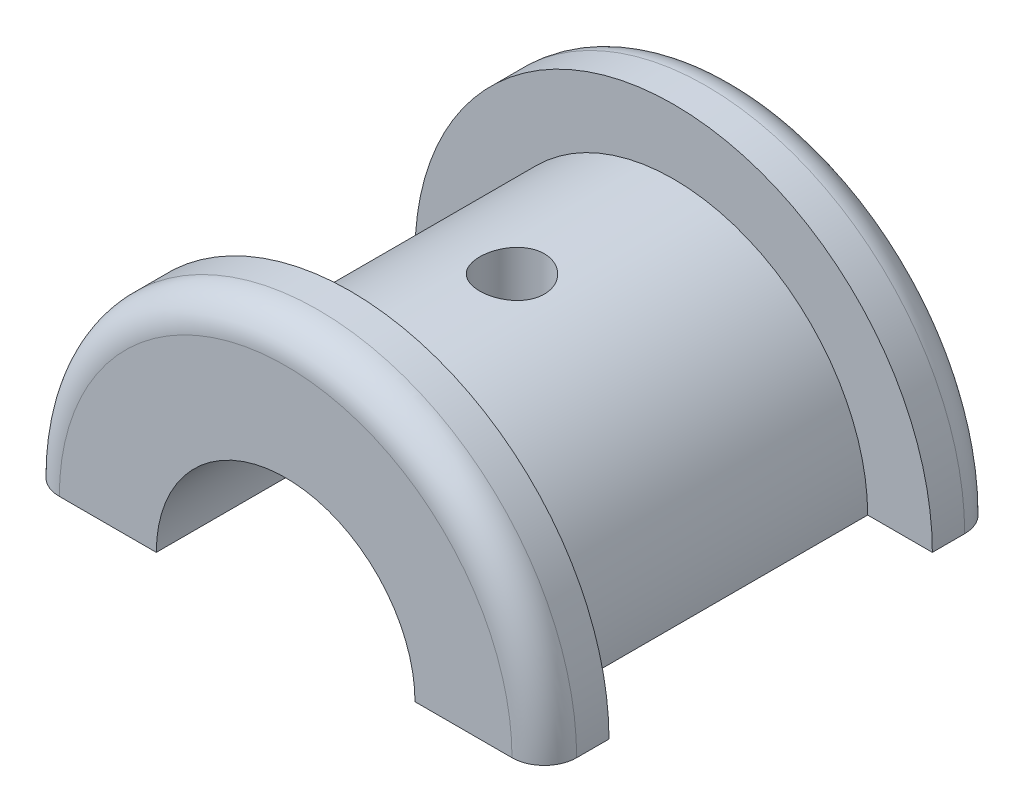
ISO-10303-21;
HEADER;
FILE_DESCRIPTION(('STEP AP214'),'2;1');
FILE_NAME('part.step','',(''),(''),'','','');
FILE_SCHEMA(('AUTOMOTIVE_DESIGN { 1 0 10303 214 1 1 1 1 }'));
ENDSEC;
DATA;
#1=APPLICATION_CONTEXT('core data for automotive mechanical design processes');
#2=APPLICATION_PROTOCOL_DEFINITION('international standard','automotive_design',2000,#1);
#3=PRODUCT_CONTEXT('',#1,'mechanical');
#4=PRODUCT('Part','Part','',(#3));
#5=PRODUCT_RELATED_PRODUCT_CATEGORY('part','',(#4));
#6=PRODUCT_DEFINITION_FORMATION('','',#4);
#7=PRODUCT_DEFINITION_CONTEXT('part definition',#1,'design');
#8=PRODUCT_DEFINITION('design','',#6,#7);
#9=PRODUCT_DEFINITION_SHAPE('','',#8);
#10=(LENGTH_UNIT() NAMED_UNIT(*) SI_UNIT(.MILLI.,.METRE.));
#11=(NAMED_UNIT(*) PLANE_ANGLE_UNIT() SI_UNIT($,.RADIAN.));
#12=(NAMED_UNIT(*) SI_UNIT($,.STERADIAN.) SOLID_ANGLE_UNIT());
#13=UNCERTAINTY_MEASURE_WITH_UNIT(LENGTH_MEASURE(1.E-05),#10,'distance_accuracy_value','');
#14=(GEOMETRIC_REPRESENTATION_CONTEXT(3) GLOBAL_UNCERTAINTY_ASSIGNED_CONTEXT((#13)) GLOBAL_UNIT_ASSIGNED_CONTEXT((#10,
#11,#12)) REPRESENTATION_CONTEXT('',''));
#15=CARTESIAN_POINT('',(0.,0.,0.));
#16=DIRECTION('',(0.,0.,1.));
#17=DIRECTION('',(1.,0.,0.));
#18=AXIS2_PLACEMENT_3D('',#15,#16,#17);
#19=CARTESIAN_POINT('',(0.,0.,7.));
#20=DIRECTION('',(0.,0.,-1.));
#21=DIRECTION('',(-1.,0.,0.));
#22=AXIS2_PLACEMENT_3D('',#19,#20,#21);
#23=CYLINDRICAL_SURFACE('',#22,4.);
#24=CARTESIAN_POINT('',(0.,0.,-7.));
#25=DIRECTION('',(0.,0.,-1.));
#26=DIRECTION('',(-1.,0.,0.));
#27=AXIS2_PLACEMENT_3D('',#24,#25,#26);
#28=CIRCLE('',#27,4.);
#29=CARTESIAN_POINT('',(-4.,0.,-7.));
#30=VERTEX_POINT('',#29);
#31=CARTESIAN_POINT('',(4.,0.,-7.));
#32=VERTEX_POINT('',#31);
#33=EDGE_CURVE('E171',#30,#32,#28,.T.);
#34=ORIENTED_EDGE('',*,*,#33,.T.);
#35=DIRECTION('',(0.,0.,-1.));
#36=VECTOR('',#35,1.);
#37=CARTESIAN_POINT('',(4.,0.,7.));
#38=LINE('',#37,#36);
#39=CARTESIAN_POINT('',(4.,0.,7.));
#40=VERTEX_POINT('',#39);
#41=EDGE_CURVE('E176',#40,#32,#38,.T.);
#42=ORIENTED_EDGE('',*,*,#41,.F.);
#43=CARTESIAN_POINT('',(0.,0.,7.));
#44=DIRECTION('',(0.,0.,-1.));
#45=DIRECTION('',(-1.,0.,0.));
#46=AXIS2_PLACEMENT_3D('',#43,#44,#45);
#47=CIRCLE('',#46,4.);
#48=CARTESIAN_POINT('',(-4.,0.,7.));
#49=VERTEX_POINT('',#48);
#50=EDGE_CURVE('E165',#49,#40,#47,.T.);
#51=ORIENTED_EDGE('',*,*,#50,.F.);
#52=DIRECTION('',(0.,0.,-1.));
#53=VECTOR('',#52,1.);
#54=CARTESIAN_POINT('',(-4.,0.,7.));
#55=LINE('',#54,#53);
#56=EDGE_CURVE('E179',#49,#30,#55,.T.);
#57=ORIENTED_EDGE('',*,*,#56,.T.);
#58=EDGE_LOOP('',(#34,#42,#51,#57));
#59=FACE_BOUND('',#58,.T.);
#60=CARTESIAN_POINT('',(0.,4.,-1.));
#61=CARTESIAN_POINT('',(0.0552507257798208,3.99999906578675,-0.999998449507894));
#62=CARTESIAN_POINT('',(0.110518771887175,3.99884385421219,-0.995405632817475));
#63=CARTESIAN_POINT('',(0.219470882513688,3.99434742553261,-0.977183232461997));
#64=CARTESIAN_POINT('',(0.273154031247159,3.99100496946646,-0.963548526974768));
#65=CARTESIAN_POINT('',(0.377347248121718,3.98250417554693,-0.927707164358608));
#66=CARTESIAN_POINT('',(0.427861042286669,3.97734801894725,-0.905510800856482));
#67=CARTESIAN_POINT('',(0.524448087936284,3.96576895871729,-0.853212406636777));
#68=CARTESIAN_POINT('',(0.570521189565839,3.95934601236034,-0.823110109254042));
#69=CARTESIAN_POINT('',(0.657867951533946,3.94578275727868,-0.755199473563859));
#70=CARTESIAN_POINT('',(0.699037126707381,3.93863138099022,-0.717258950027215));
#71=CARTESIAN_POINT('',(0.774499284802203,3.92449080078353,-0.635031863394056));
#72=CARTESIAN_POINT('',(0.808791491299423,3.91750161525566,-0.590744584702336));
#73=CARTESIAN_POINT('',(0.870017695199355,3.9043651713314,-0.496269848841709));
#74=CARTESIAN_POINT('',(0.896834810616904,3.89823196313737,-0.446004512793064));
#75=CARTESIAN_POINT('',(0.941597939033684,3.88766329874815,-0.341501058894427));
#76=CARTESIAN_POINT('',(0.959545370292888,3.88322757115193,-0.287263577782826));
#77=CARTESIAN_POINT('',(0.985703224536193,3.87666984478367,-0.177504334531684));
#78=CARTESIAN_POINT('',(0.994101512222225,3.87450327383617,-0.122030069300134));
#79=CARTESIAN_POINT('',(1.00150785004523,3.87259575025161,-0.0104209539906792));
#80=CARTESIAN_POINT('',(1.00051742787865,3.87285440299096,0.045713787132407));
#81=CARTESIAN_POINT('',(0.98932434975952,3.87572803664412,0.155610538496321));
#82=CARTESIAN_POINT('',(0.979345560127013,3.87828575334586,0.209397080976731));
#83=CARTESIAN_POINT('',(0.950816124602071,3.88537806450989,0.314507367274195));
#84=CARTESIAN_POINT('',(0.932264868046282,3.88991279980464,0.365830935352656));
#85=CARTESIAN_POINT('',(0.886926318624769,3.90050075936124,0.465158677501377));
#86=CARTESIAN_POINT('',(0.860057778155274,3.90656884979614,0.513124114526369));
#87=CARTESIAN_POINT('',(0.798904184009969,3.91953140564257,0.603945806504558));
#88=CARTESIAN_POINT('',(0.764617832539226,3.9264260155649,0.64680116537817));
#89=CARTESIAN_POINT('',(0.688442283120812,3.94050587026521,0.7274690771296));
#90=CARTESIAN_POINT('',(0.646364172110573,3.94769379651981,0.765102993374233));
#91=CARTESIAN_POINT('',(0.556407945002467,3.96137310385857,0.832814161642603));
#92=CARTESIAN_POINT('',(0.508529651805296,3.96786446366277,0.862891182842377));
#93=CARTESIAN_POINT('',(0.408077259120928,3.97945154729455,0.914700390816257));
#94=CARTESIAN_POINT('',(0.355487595472416,3.9845424008515,0.936403560169619));
#95=CARTESIAN_POINT('',(0.247250672095255,3.99271944660946,0.970611537139715));
#96=CARTESIAN_POINT('',(0.191603999433656,3.99580602226187,0.983118104278759));
#97=CARTESIAN_POINT('',(0.0803599802600179,3.9995699951425,0.998305043705892));
#98=CARTESIAN_POINT('',(0.0247978133254733,4.00030702338852,1.0012286840502));
#99=CARTESIAN_POINT('',(-0.0860219165343386,3.999458698763,0.997833998629676));
#100=CARTESIAN_POINT('',(-0.14127950642973,3.99787355494564,0.991516504800578));
#101=CARTESIAN_POINT('',(-0.249076179184328,3.99259720751571,0.970019394405747));
#102=CARTESIAN_POINT('',(-0.301643412645836,3.98893756123874,0.954972491015342));
#103=CARTESIAN_POINT('',(-0.403504861635007,3.97992471089423,0.916595277314369));
#104=CARTESIAN_POINT('',(-0.452798746021756,3.97457133579928,0.893264130457887));
#105=CARTESIAN_POINT('',(-0.547682089619898,3.96262205284207,0.838509247416848));
#106=CARTESIAN_POINT('',(-0.59319029455722,3.95600578244621,0.806949258402158));
#107=CARTESIAN_POINT('',(-0.678351075762164,3.94229672791613,0.736806727468687));
#108=CARTESIAN_POINT('',(-0.718002639315338,3.93520386167803,0.698222973588729));
#109=CARTESIAN_POINT('',(-0.79132704538182,3.92112637973847,0.613998692770357));
#110=CARTESIAN_POINT('',(-0.824829245081355,3.91414869458187,0.568208197998385));
#111=CARTESIAN_POINT('',(-0.883673839341798,3.90128585584826,0.471511577022855));
#112=CARTESIAN_POINT('',(-0.909016596105291,3.89540065378017,0.420605678026831));
#113=CARTESIAN_POINT('',(-0.950634280406194,3.88545396489777,0.315396185057948));
#114=CARTESIAN_POINT('',(-0.96696293110271,3.88138170194604,0.261114914437328));
#115=CARTESIAN_POINT('',(-0.990230439969186,3.87551162726789,0.150460241407261));
#116=CARTESIAN_POINT('',(-0.997171351652438,3.87371331813291,0.0940872993116734));
#117=CARTESIAN_POINT('',(-1.00135906022266,3.87263267469304,-0.0174140159034679));
#118=CARTESIAN_POINT('',(-0.998878598520078,3.87327955152176,-0.0725316234164864));
#119=CARTESIAN_POINT('',(-0.984918185541911,3.87685272671895,-0.181535925778653));
#120=CARTESIAN_POINT('',(-0.973438415124513,3.87977897927904,-0.235422645342433));
#121=CARTESIAN_POINT('',(-0.941954212961863,3.88754173788482,-0.340138972710272));
#122=CARTESIAN_POINT('',(-0.922000936453584,3.89236676824206,-0.390984870160138));
#123=CARTESIAN_POINT('',(-0.874176609070047,3.90338503816552,-0.488643588475792));
#124=CARTESIAN_POINT('',(-0.846304460022792,3.90957846747182,-0.535455848791277));
#125=CARTESIAN_POINT('',(-0.782578499091424,3.92283756175675,-0.62503641933468));
#126=CARTESIAN_POINT('',(-0.746535441941503,3.92992176554505,-0.667667382282639));
#127=CARTESIAN_POINT('',(-0.667859580793157,3.94405351497524,-0.746364696530272));
#128=CARTESIAN_POINT('',(-0.625225214174097,3.95110105151373,-0.782429486741979));
#129=CARTESIAN_POINT('',(-0.533645057801727,3.96451770431775,-0.847607539043071));
#130=CARTESIAN_POINT('',(-0.484598948210924,3.97087222243912,-0.876583075781053));
#131=CARTESIAN_POINT('',(-0.382177373006984,3.98203283316746,-0.925831641960354));
#132=CARTESIAN_POINT('',(-0.32880504229116,3.98684003466521,-0.946110907099024));
#133=CARTESIAN_POINT('',(-0.229606835495648,3.99365373043694,-0.974381220219769));
#134=CARTESIAN_POINT('',(-0.184253447272046,3.9960172336846,-0.983967495368956));
#135=CARTESIAN_POINT('',(-0.0926040476908559,3.99919070154632,-0.996777295747961));
#136=CARTESIAN_POINT('',(-0.0463081074950777,4.00000078300596,-1.00000129953687));
#137=CARTESIAN_POINT('',(0.,4.,-1.));
#138=B_SPLINE_CURVE_WITH_KNOTS('',3,(#60,#61,#62,#63,#64,#65,#66,#67,#68,#69,#70,#71,#72,#73,
#74,#75,#76,#77,#78,#79,#80,#81,#82,#83,#84,#85,#86,#87,#88,#89,#90,#91,#92,#93,#94,#95,#96,#97,
#98,#99,#100,#101,#102,#103,#104,#105,#106,#107,#108,#109,#110,#111,#112,#113,#114,#115,#116,
#117,#118,#119,#120,#121,#122,#123,#124,#125,#126,#127,#128,#129,#130,#131,#132,#133,#134,#135,
#136,#137),.UNSPECIFIED.,.T.,.F.,(4,2,2,2,2,2,2,2,2,2,2,2,2,2,2,2,2,2,2,2,2,2,2,2,2,2,2,2,2,2,2,
2,2,2,2,2,2,2,4),(0.,0.16558247498126,0.331258825175933,0.496736601524071,0.662219960112885,
0.83076290291426,0.999324863867079,1.17039098363871,1.34142974112912,1.50904196732953,
1.67662692075131,1.84014998004679,2.00368468977359,2.16887018582586,2.33408460557442,
2.50401000646013,2.67394059705498,2.84445486006076,3.01493649125762,3.18105539299517,
3.34715934075162,3.51080183009358,3.67446084881527,3.84102391710235,4.00761575338679,
4.17829672802984,4.34897012499672,4.51861503076024,4.68822282168272,4.85295853599075,
5.01769093970689,5.18144267039631,5.34521712091267,5.51326384273273,5.68135046513612,
5.85248123666392,6.02348909214233,6.16228161961432,6.3010637069536),.UNSPECIFIED.);
#139=CARTESIAN_POINT('',(0.,4.,-1.));
#140=VERTEX_POINT('',#139);
#141=EDGE_CURVE('E154',#140,#140,#138,.T.);
#142=ORIENTED_EDGE('',*,*,#141,.F.);
#143=EDGE_LOOP('',(#142));
#144=FACE_BOUND('',#143,.T.);
#145=ADVANCED_FACE('F37',(#59,#144),#23,.F.);
#146=CARTESIAN_POINT('',(0.,0.,-5.));
#147=DIRECTION('',(0.,0.,1.));
#148=DIRECTION('',(1.,0.,0.));
#149=AXIS2_PLACEMENT_3D('',#146,#147,#148);
#150=CYLINDRICAL_SURFACE('',#149,6.);
#151=CARTESIAN_POINT('',(0.,0.,5.));
#152=DIRECTION('',(0.,0.,-1.));
#153=DIRECTION('',(-1.,0.,0.));
#154=AXIS2_PLACEMENT_3D('',#151,#152,#153);
#155=CIRCLE('',#154,6.);
#156=CARTESIAN_POINT('',(-6.,0.,5.));
#157=VERTEX_POINT('',#156);
#158=CARTESIAN_POINT('',(6.,0.,5.));
#159=VERTEX_POINT('',#158);
#160=EDGE_CURVE('E127',#157,#159,#155,.T.);
#161=ORIENTED_EDGE('',*,*,#160,.T.);
#162=DIRECTION('',(0.,0.,1.));
#163=VECTOR('',#162,1.);
#164=CARTESIAN_POINT('',(6.,0.,-5.));
#165=LINE('',#164,#163);
#166=CARTESIAN_POINT('',(6.,0.,-5.));
#167=VERTEX_POINT('',#166);
#168=EDGE_CURVE('E120',#167,#159,#165,.T.);
#169=ORIENTED_EDGE('',*,*,#168,.F.);
#170=CARTESIAN_POINT('',(0.,0.,-5.));
#171=DIRECTION('',(0.,0.,-1.));
#172=DIRECTION('',(-1.,0.,0.));
#173=AXIS2_PLACEMENT_3D('',#170,#171,#172);
#174=CIRCLE('',#173,6.);
#175=CARTESIAN_POINT('',(-6.,0.,-5.));
#176=VERTEX_POINT('',#175);
#177=EDGE_CURVE('E124',#176,#167,#174,.T.);
#178=ORIENTED_EDGE('',*,*,#177,.F.);
#179=DIRECTION('',(0.,0.,1.));
#180=VECTOR('',#179,1.);
#181=CARTESIAN_POINT('',(-6.,0.,-5.));
#182=LINE('',#181,#180);
#183=EDGE_CURVE('E130',#176,#157,#182,.T.);
#184=ORIENTED_EDGE('',*,*,#183,.T.);
#185=EDGE_LOOP('',(#161,#169,#178,#184));
#186=FACE_BOUND('',#185,.T.);
#187=CARTESIAN_POINT('',(0.,6.,-1.));
#188=CARTESIAN_POINT('',(-0.0557563619832859,5.99999904467529,-0.999997764420873));
#189=CARTESIAN_POINT('',(-0.111543152735528,5.99921471165214,-0.995321090012432));
#190=CARTESIAN_POINT('',(-0.221552088669217,5.99616137976555,-0.97674573649387));
#191=CARTESIAN_POINT('',(-0.275772747183699,5.99389101569556,-0.962838577235358));
#192=CARTESIAN_POINT('',(-0.381041898885058,5.9881202729458,-0.926233820562898));
#193=CARTESIAN_POINT('',(-0.43209294737276,5.98462090063677,-0.903543413743771));
#194=CARTESIAN_POINT('',(-0.529656736791178,5.97677690832828,-0.850035083179042));
#195=CARTESIAN_POINT('',(-0.576169995951436,5.97243238501774,-0.819218089006801));
#196=CARTESIAN_POINT('',(-0.663789045716672,5.96333326983325,-0.750017966471816));
#197=CARTESIAN_POINT('',(-0.704845161413987,5.95857548725943,-0.711572354145548));
#198=CARTESIAN_POINT('',(-0.779955399463971,5.94921050750693,-0.628340812610876));
#199=CARTESIAN_POINT('',(-0.814009079756389,5.94460331985067,-0.583554483417356));
#200=CARTESIAN_POINT('',(-0.874346850242053,5.93603026303912,-0.488571613521178));
#201=CARTESIAN_POINT('',(-0.900581821144401,5.93206851636654,-0.438343465278098));
#202=CARTESIAN_POINT('',(-0.944223346164488,5.9252791591787,-0.33411617427975));
#203=CARTESIAN_POINT('',(-0.961630496626245,5.92245147205723,-0.280117286528947));
#204=CARTESIAN_POINT('',(-0.986965751113923,5.91828214737102,-0.170407890057384));
#205=CARTESIAN_POINT('',(-0.994979611654161,5.9169270739428,-0.114717705399443));
#206=CARTESIAN_POINT('',(-1.00156669011595,5.9158157557466,-0.00276788924661139));
#207=CARTESIAN_POINT('',(-1.0001405761556,5.91605939782886,0.0534917016669199));
#208=CARTESIAN_POINT('',(-0.987958039358461,5.91810571545422,0.164371144510179));
#209=CARTESIAN_POINT('',(-0.977297952755909,5.91989229327567,0.219001921418093));
#210=CARTESIAN_POINT('',(-0.947101256161378,5.92479798084403,0.325688527131653));
#211=CARTESIAN_POINT('',(-0.927564341727896,5.92791713629309,0.377744267555419));
#212=CARTESIAN_POINT('',(-0.880070898437565,5.9351539173364,0.478091529376368));
#213=CARTESIAN_POINT('',(-0.852074365551885,5.9392762684293,0.526363762432491));
#214=CARTESIAN_POINT('',(-0.788484807022973,5.94805167366003,0.617561760215354));
#215=CARTESIAN_POINT('',(-0.752891168261715,5.95270477061714,0.660487092981973));
#216=CARTESIAN_POINT('',(-0.674592884863621,5.96208811151914,0.740330434322939));
#217=CARTESIAN_POINT('',(-0.631805585549251,5.96681859692661,0.777167407416033));
#218=CARTESIAN_POINT('',(-0.540614099592659,5.97577040558689,0.843151105066136));
#219=CARTESIAN_POINT('',(-0.492209876762569,5.97999172555898,0.872297780073291));
#220=CARTESIAN_POINT('',(-0.391082366466684,5.98745557157165,0.922080890854513));
#221=CARTESIAN_POINT('',(-0.338355490225864,5.99069727362979,0.942710167732503));
#222=CARTESIAN_POINT('',(-0.230119338241092,5.99583001205064,0.974797686098392));
#223=CARTESIAN_POINT('',(-0.174610295671787,5.9977211614019,0.986256694789487));
#224=CARTESIAN_POINT('',(-0.0630839605206496,5.99992451937074,0.999568543384454));
#225=CARTESIAN_POINT('',(-0.00708029486040471,6.00025501205114,1.00153262872224));
#226=CARTESIAN_POINT('',(0.104455909155955,5.99934989768468,0.996095462228751));
#227=CARTESIAN_POINT('',(0.159988465556815,5.99811435089647,0.988694570746505));
#228=CARTESIAN_POINT('',(0.268662470218705,5.99422730775281,0.964830060265809));
#229=CARTESIAN_POINT('',(0.321816347354151,5.99158441920524,0.94842151664395));
#230=CARTESIAN_POINT('',(0.424618753944177,5.98517785782144,0.907066192720187));
#231=CARTESIAN_POINT('',(0.474267086363887,5.98141412204808,0.882118932945891));
#232=CARTESIAN_POINT('',(0.569132275787583,5.97313806520963,0.824139550121285));
#233=CARTESIAN_POINT('',(0.614306100374859,5.96861942354809,0.791037937533099));
#234=CARTESIAN_POINT('',(0.698497434201075,5.9593538695676,0.717785073845977));
#235=CARTESIAN_POINT('',(0.737514495878633,5.95460694068619,0.677633310689333));
#236=CARTESIAN_POINT('',(0.8086971118632,5.94536070094338,0.590920980771431));
#237=CARTESIAN_POINT('',(0.840787504445486,5.94086446454842,0.544298333794236));
#238=CARTESIAN_POINT('',(0.896680924117994,5.93268611911154,0.446258812344585));
#239=CARTESIAN_POINT('',(0.920484213907929,5.92900398426408,0.394842089909002));
#240=CARTESIAN_POINT('',(0.959015332589259,5.92289381479082,0.288884106875147));
#241=CARTESIAN_POINT('',(0.973780573019178,5.92046061724426,0.234356761987805));
#242=CARTESIAN_POINT('',(0.993934181511311,5.91711086734104,0.123551948311296));
#243=CARTESIAN_POINT('',(0.999323364778467,5.91619418313089,0.0672746321071795));
#244=CARTESIAN_POINT('',(1.00054914641894,5.91598693233605,-0.0446820663849633));
#245=CARTESIAN_POINT('',(0.996504054450075,5.9166762260226,-0.100360151430115));
#246=CARTESIAN_POINT('',(0.979231935582739,5.91955912581491,-0.210231699220306));
#247=CARTESIAN_POINT('',(0.966004938444991,5.92175272704486,-0.264425166776748));
#248=CARTESIAN_POINT('',(0.930789795837961,5.92738942512687,-0.369743374917045));
#249=CARTESIAN_POINT('',(0.908811836240177,5.93083106887868,-0.420871604022409));
#250=CARTESIAN_POINT('',(0.856730801566363,5.93857747568883,-0.518734267677938));
#251=CARTESIAN_POINT('',(0.826627323499425,5.9428822815536,-0.565468484148853));
#252=CARTESIAN_POINT('',(0.758727553748862,5.95193381618249,-0.653814233243101));
#253=CARTESIAN_POINT('',(0.720844225437459,5.95668518230521,-0.695358406680109));
#254=CARTESIAN_POINT('',(0.638643612552092,5.96605748944336,-0.771540641789974));
#255=CARTESIAN_POINT('',(0.594324845165054,5.97067840010619,-0.806177107455268));
#256=CARTESIAN_POINT('',(0.500147667856113,5.97930611856888,-0.867779307279978));
#257=CARTESIAN_POINT('',(0.450253115013127,5.98330846501242,-0.894690415725181));
#258=CARTESIAN_POINT('',(0.346605227751592,5.9902046704071,-0.939707793843968));
#259=CARTESIAN_POINT('',(0.292855797932004,5.99309963270993,-0.957822832431879));
#260=CARTESIAN_POINT('',(0.19908132401816,5.99682316333182,-0.980802109650666));
#261=CARTESIAN_POINT('',(0.159623532119379,5.99800810909344,-0.987989787846386));
#262=CARTESIAN_POINT('',(0.0801157241279236,5.99959686394448,-0.997589495137901));
#263=CARTESIAN_POINT('',(0.0400657182433977,6.00000068648257,-1.00000160645494));
#264=CARTESIAN_POINT('',(0.,6.,-1.));
#265=B_SPLINE_CURVE_WITH_KNOTS('',3,(#187,#188,#189,#190,#191,#192,#193,#194,#195,#196,#197,
#198,#199,#200,#201,#202,#203,#204,#205,#206,#207,#208,#209,#210,#211,#212,#213,#214,#215,#216,
#217,#218,#219,#220,#221,#222,#223,#224,#225,#226,#227,#228,#229,#230,#231,#232,#233,#234,#235,
#236,#237,#238,#239,#240,#241,#242,#243,#244,#245,#246,#247,#248,#249,#250,#251,#252,#253,#254,
#255,#256,#257,#258,#259,#260,#261,#262,#263,#264),.UNSPECIFIED.,.T.,.F.,(4,2,2,2,2,2,2,2,2,2,2,
2,2,2,2,2,2,2,2,2,2,2,2,2,2,2,2,2,2,2,2,2,2,2,2,2,2,2,4),(0.,0.167122633975404,
0.334399018278168,0.501538746810108,0.668659365069916,0.837209964249328,1.00577120067943,
1.17537008329536,1.34495750750473,1.51298430841369,1.68099921728355,1.84728208704163,
2.01357066010152,2.18065822653023,2.34775928272229,2.51693107964531,2.68610396654339,
2.85541875566361,3.02471937808459,3.19203153396559,3.35933725214344,3.52563122802566,
3.69193454330427,3.85970730250809,4.02749225221713,4.19701528803048,4.36653294950377,
4.53534408936709,4.70414055114647,4.8708316380908,5.03752218475253,5.20401927290489,
5.37052462011734,5.53900553677357,5.70752533551589,5.8772089264288,6.04672300852029,
6.16681699265607,6.28690890910787),.UNSPECIFIED.);
#266=CARTESIAN_POINT('',(0.,6.,-1.));
#267=VERTEX_POINT('',#266);
#268=EDGE_CURVE('E41',#267,#267,#265,.T.);
#269=ORIENTED_EDGE('',*,*,#268,.F.);
#270=EDGE_LOOP('',(#269));
#271=FACE_BOUND('',#270,.T.);
#272=ADVANCED_FACE('F122',(#186,#271),#150,.T.);
#273=CARTESIAN_POINT('',(0.,0.,7.));
#274=DIRECTION('',(0.,0.,-1.));
#275=DIRECTION('',(-1.,0.,0.));
#276=AXIS2_PLACEMENT_3D('',#273,#274,#275);
#277=CYLINDRICAL_SURFACE('',#276,8.);
#278=DIRECTION('',(0.,0.,-1.));
#279=VECTOR('',#278,1.);
#280=CARTESIAN_POINT('',(-8.,0.,7.));
#281=LINE('',#280,#279);
#282=CARTESIAN_POINT('',(-8.,0.,6.));
#283=VERTEX_POINT('',#282);
#284=CARTESIAN_POINT('',(-8.,0.,5.));
#285=VERTEX_POINT('',#284);
#286=EDGE_CURVE('E183',#283,#285,#281,.T.);
#287=ORIENTED_EDGE('',*,*,#286,.F.);
#288=CARTESIAN_POINT('',(0.,0.,6.));
#289=DIRECTION('',(0.,0.,-1.));
#290=DIRECTION('',(-1.,0.,0.));
#291=AXIS2_PLACEMENT_3D('',#288,#289,#290);
#292=CIRCLE('',#291,8.);
#293=CARTESIAN_POINT('',(8.,0.,6.));
#294=VERTEX_POINT('',#293);
#295=EDGE_CURVE('E11',#283,#294,#292,.T.);
#296=ORIENTED_EDGE('',*,*,#295,.T.);
#297=DIRECTION('',(0.,0.,-1.));
#298=VECTOR('',#297,1.);
#299=CARTESIAN_POINT('',(8.,0.,7.));
#300=LINE('',#299,#298);
#301=CARTESIAN_POINT('',(8.,0.,5.));
#302=VERTEX_POINT('',#301);
#303=EDGE_CURVE('E174',#294,#302,#300,.T.);
#304=ORIENTED_EDGE('',*,*,#303,.T.);
#305=CARTESIAN_POINT('',(0.,0.,5.));
#306=DIRECTION('',(0.,0.,1.));
#307=DIRECTION('',(1.,0.,0.));
#308=AXIS2_PLACEMENT_3D('',#305,#306,#307);
#309=CIRCLE('',#308,8.);
#310=EDGE_CURVE('E156',#302,#285,#309,.T.);
#311=ORIENTED_EDGE('',*,*,#310,.T.);
#312=EDGE_LOOP('',(#287,#296,#304,#311));
#313=FACE_BOUND('',#312,.T.);
#314=ADVANCED_FACE('F240',(#313),#277,.T.);
#315=CARTESIAN_POINT('',(8.,0.,-5.));
#316=VERTEX_POINT('',#315);
#317=CARTESIAN_POINT('',(8.,0.,-6.));
#318=VERTEX_POINT('',#317);
#319=EDGE_CURVE('E145',#316,#318,#300,.T.);
#320=ORIENTED_EDGE('',*,*,#319,.T.);
#321=CARTESIAN_POINT('',(0.,0.,-6.));
#322=DIRECTION('',(0.,0.,-1.));
#323=DIRECTION('',(-1.,0.,0.));
#324=AXIS2_PLACEMENT_3D('',#321,#322,#323);
#325=CIRCLE('',#324,8.);
#326=CARTESIAN_POINT('',(-8.,0.,-6.));
#327=VERTEX_POINT('',#326);
#328=EDGE_CURVE('E185',#318,#327,#325,.F.);
#329=ORIENTED_EDGE('',*,*,#328,.T.);
#330=CARTESIAN_POINT('',(-8.,0.,-5.));
#331=VERTEX_POINT('',#330);
#332=EDGE_CURVE('E182',#331,#327,#281,.T.);
#333=ORIENTED_EDGE('',*,*,#332,.F.);
#334=CARTESIAN_POINT('',(0.,0.,-5.));
#335=DIRECTION('',(0.,0.,1.));
#336=DIRECTION('',(1.,0.,0.));
#337=AXIS2_PLACEMENT_3D('',#334,#335,#336);
#338=CIRCLE('',#337,8.);
#339=EDGE_CURVE('E146',#316,#331,#338,.T.);
#340=ORIENTED_EDGE('',*,*,#339,.F.);
#341=EDGE_LOOP('',(#320,#329,#333,#340));
#342=FACE_BOUND('',#341,.T.);
#343=ADVANCED_FACE('F222',(#342),#277,.T.);
#344=CARTESIAN_POINT('',(-8.,0.,7.));
#345=DIRECTION('',(0.,1.,0.));
#346=DIRECTION('',(0.,0.,1.));
#347=AXIS2_PLACEMENT_3D('',#344,#345,#346);
#348=PLANE('',#347);
#349=ORIENTED_EDGE('',*,*,#332,.T.);
#350=CARTESIAN_POINT('',(-7.,0.,-6.));
#351=DIRECTION('',(0.,1.,0.));
#352=DIRECTION('',(0.,0.,1.));
#353=AXIS2_PLACEMENT_3D('',#350,#351,#352);
#354=CIRCLE('',#353,1.);
#355=CARTESIAN_POINT('',(-7.,0.,-7.));
#356=VERTEX_POINT('',#355);
#357=EDGE_CURVE('E190',#327,#356,#354,.F.);
#358=ORIENTED_EDGE('',*,*,#357,.T.);
#359=DIRECTION('',(1.,0.,0.));
#360=VECTOR('',#359,1.);
#361=CARTESIAN_POINT('',(-8.,0.,-7.));
#362=LINE('',#361,#360);
#363=EDGE_CURVE('E161',#356,#30,#362,.T.);
#364=ORIENTED_EDGE('',*,*,#363,.T.);
#365=ORIENTED_EDGE('',*,*,#56,.F.);
#366=DIRECTION('',(1.,0.,0.));
#367=VECTOR('',#366,1.);
#368=CARTESIAN_POINT('',(-8.,0.,7.));
#369=LINE('',#368,#367);
#370=CARTESIAN_POINT('',(-7.,0.,7.));
#371=VERTEX_POINT('',#370);
#372=EDGE_CURVE('E163',#371,#49,#369,.T.);
#373=ORIENTED_EDGE('',*,*,#372,.F.);
#374=CARTESIAN_POINT('',(-7.,0.,6.));
#375=DIRECTION('',(0.,1.,0.));
#376=DIRECTION('',(0.,0.,1.));
#377=AXIS2_PLACEMENT_3D('',#374,#375,#376);
#378=CIRCLE('',#377,1.);
#379=EDGE_CURVE('E188',#371,#283,#378,.F.);
#380=ORIENTED_EDGE('',*,*,#379,.T.);
#381=ORIENTED_EDGE('',*,*,#286,.T.);
#382=DIRECTION('',(1.,0.,0.));
#383=VECTOR('',#382,1.);
#384=CARTESIAN_POINT('',(-8.,0.,5.));
#385=LINE('',#384,#383);
#386=EDGE_CURVE('E139',#285,#157,#385,.T.);
#387=ORIENTED_EDGE('',*,*,#386,.T.);
#388=ORIENTED_EDGE('',*,*,#183,.F.);
#389=DIRECTION('',(1.,0.,0.));
#390=VECTOR('',#389,1.);
#391=CARTESIAN_POINT('',(-8.,0.,-5.));
#392=LINE('',#391,#390);
#393=EDGE_CURVE('E131',#331,#176,#392,.T.);
#394=ORIENTED_EDGE('',*,*,#393,.F.);
#395=EDGE_LOOP('',(#349,#358,#364,#365,#373,#380,#381,#387,#388,#394));
#396=FACE_BOUND('',#395,.T.);
#397=ADVANCED_FACE('F206',(#396),#348,.F.);
#398=CARTESIAN_POINT('',(4.,0.,7.));
#399=DIRECTION('',(0.,1.,0.));
#400=DIRECTION('',(0.,0.,1.));
#401=AXIS2_PLACEMENT_3D('',#398,#399,#400);
#402=PLANE('',#401);
#403=DIRECTION('',(1.,0.,0.));
#404=VECTOR('',#403,1.);
#405=CARTESIAN_POINT('',(4.,0.,-7.));
#406=LINE('',#405,#404);
#407=CARTESIAN_POINT('',(7.,0.,-7.));
#408=VERTEX_POINT('',#407);
#409=EDGE_CURVE('E166',#32,#408,#406,.T.);
#410=ORIENTED_EDGE('',*,*,#409,.T.);
#411=CARTESIAN_POINT('',(7.,0.,-6.));
#412=DIRECTION('',(0.,1.,0.));
#413=DIRECTION('',(0.,0.,1.));
#414=AXIS2_PLACEMENT_3D('',#411,#412,#413);
#415=CIRCLE('',#414,1.);
#416=EDGE_CURVE('E195',#408,#318,#415,.F.);
#417=ORIENTED_EDGE('',*,*,#416,.T.);
#418=ORIENTED_EDGE('',*,*,#319,.F.);
#419=DIRECTION('',(1.,0.,0.));
#420=VECTOR('',#419,1.);
#421=CARTESIAN_POINT('',(6.,0.,-5.));
#422=LINE('',#421,#420);
#423=EDGE_CURVE('E135',#167,#316,#422,.T.);
#424=ORIENTED_EDGE('',*,*,#423,.F.);
#425=ORIENTED_EDGE('',*,*,#168,.T.);
#426=DIRECTION('',(1.,0.,0.));
#427=VECTOR('',#426,1.);
#428=CARTESIAN_POINT('',(6.,0.,5.));
#429=LINE('',#428,#427);
#430=EDGE_CURVE('E153',#159,#302,#429,.T.);
#431=ORIENTED_EDGE('',*,*,#430,.T.);
#432=ORIENTED_EDGE('',*,*,#303,.F.);
#433=CARTESIAN_POINT('',(7.,0.,6.));
#434=DIRECTION('',(0.,1.,0.));
#435=DIRECTION('',(0.,0.,1.));
#436=AXIS2_PLACEMENT_3D('',#433,#434,#435);
#437=CIRCLE('',#436,1.);
#438=CARTESIAN_POINT('',(7.,0.,7.));
#439=VERTEX_POINT('',#438);
#440=EDGE_CURVE('E58',#294,#439,#437,.F.);
#441=ORIENTED_EDGE('',*,*,#440,.T.);
#442=DIRECTION('',(1.,0.,0.));
#443=VECTOR('',#442,1.);
#444=CARTESIAN_POINT('',(4.,0.,7.));
#445=LINE('',#444,#443);
#446=EDGE_CURVE('E168',#40,#439,#445,.T.);
#447=ORIENTED_EDGE('',*,*,#446,.F.);
#448=ORIENTED_EDGE('',*,*,#41,.T.);
#449=EDGE_LOOP('',(#410,#417,#418,#424,#425,#431,#432,#441,#447,#448));
#450=FACE_BOUND('',#449,.T.);
#451=ADVANCED_FACE('F143',(#450),#402,.F.);
#452=CARTESIAN_POINT('',(0.,0.,7.));
#453=DIRECTION('',(0.,0.,-1.));
#454=DIRECTION('',(-1.,0.,0.));
#455=AXIS2_PLACEMENT_3D('',#452,#453,#454);
#456=PLANE('',#455);
#457=ORIENTED_EDGE('',*,*,#446,.T.);
#458=CARTESIAN_POINT('',(0.,0.,7.));
#459=DIRECTION('',(0.,0.,-1.));
#460=DIRECTION('',(-1.,0.,0.));
#461=AXIS2_PLACEMENT_3D('',#458,#459,#460);
#462=CIRCLE('',#461,7.);
#463=EDGE_CURVE('E51',#439,#371,#462,.F.);
#464=ORIENTED_EDGE('',*,*,#463,.T.);
#465=ORIENTED_EDGE('',*,*,#372,.T.);
#466=ORIENTED_EDGE('',*,*,#50,.T.);
#467=EDGE_LOOP('',(#457,#464,#465,#466));
#468=FACE_BOUND('',#467,.T.);
#469=ADVANCED_FACE('F201',(#468),#456,.F.);
#470=CARTESIAN_POINT('',(0.,0.,-7.));
#471=DIRECTION('',(0.,0.,-1.));
#472=DIRECTION('',(-1.,0.,0.));
#473=AXIS2_PLACEMENT_3D('',#470,#471,#472);
#474=PLANE('',#473);
#475=ORIENTED_EDGE('',*,*,#363,.F.);
#476=CARTESIAN_POINT('',(0.,0.,-7.));
#477=DIRECTION('',(0.,0.,-1.));
#478=DIRECTION('',(-1.,0.,0.));
#479=AXIS2_PLACEMENT_3D('',#476,#477,#478);
#480=CIRCLE('',#479,7.);
#481=EDGE_CURVE('E192',#356,#408,#480,.T.);
#482=ORIENTED_EDGE('',*,*,#481,.T.);
#483=ORIENTED_EDGE('',*,*,#409,.F.);
#484=ORIENTED_EDGE('',*,*,#33,.F.);
#485=EDGE_LOOP('',(#475,#482,#483,#484));
#486=FACE_BOUND('',#485,.T.);
#487=ADVANCED_FACE('F216',(#486),#474,.T.);
#488=CARTESIAN_POINT('',(0.,0.,-5.));
#489=DIRECTION('',(0.,0.,-1.));
#490=DIRECTION('',(-1.,0.,0.));
#491=AXIS2_PLACEMENT_3D('',#488,#489,#490);
#492=PLANE('',#491);
#493=ORIENTED_EDGE('',*,*,#177,.T.);
#494=ORIENTED_EDGE('',*,*,#423,.T.);
#495=ORIENTED_EDGE('',*,*,#339,.T.);
#496=ORIENTED_EDGE('',*,*,#393,.T.);
#497=EDGE_LOOP('',(#493,#494,#495,#496));
#498=FACE_BOUND('',#497,.T.);
#499=ADVANCED_FACE('F134',(#498),#492,.F.);
#500=CARTESIAN_POINT('',(0.,0.,5.));
#501=DIRECTION('',(0.,0.,-1.));
#502=DIRECTION('',(-1.,0.,0.));
#503=AXIS2_PLACEMENT_3D('',#500,#501,#502);
#504=PLANE('',#503);
#505=ORIENTED_EDGE('',*,*,#160,.F.);
#506=ORIENTED_EDGE('',*,*,#386,.F.);
#507=ORIENTED_EDGE('',*,*,#310,.F.);
#508=ORIENTED_EDGE('',*,*,#430,.F.);
#509=EDGE_LOOP('',(#505,#506,#507,#508));
#510=FACE_BOUND('',#509,.T.);
#511=ADVANCED_FACE('F226',(#510),#504,.T.);
#512=CARTESIAN_POINT('',(0.,0.,-6.));
#513=DIRECTION('',(0.,0.,-1.));
#514=DIRECTION('',(-1.,0.,0.));
#515=AXIS2_PLACEMENT_3D('',#512,#513,#514);
#516=TOROIDAL_SURFACE('',#515,7.,1.);
#517=ORIENTED_EDGE('',*,*,#416,.F.);
#518=ORIENTED_EDGE('',*,*,#481,.F.);
#519=ORIENTED_EDGE('',*,*,#357,.F.);
#520=ORIENTED_EDGE('',*,*,#328,.F.);
#521=EDGE_LOOP('',(#517,#518,#519,#520));
#522=FACE_BOUND('',#521,.T.);
#523=ADVANCED_FACE('F219',(#522),#516,.T.);
#524=CARTESIAN_POINT('',(0.,0.,6.));
#525=DIRECTION('',(0.,0.,-1.));
#526=DIRECTION('',(-1.,0.,0.));
#527=AXIS2_PLACEMENT_3D('',#524,#525,#526);
#528=TOROIDAL_SURFACE('',#527,7.,1.);
#529=ORIENTED_EDGE('',*,*,#440,.F.);
#530=ORIENTED_EDGE('',*,*,#295,.F.);
#531=ORIENTED_EDGE('',*,*,#379,.F.);
#532=ORIENTED_EDGE('',*,*,#463,.F.);
#533=EDGE_LOOP('',(#529,#530,#531,#532));
#534=FACE_BOUND('',#533,.T.);
#535=ADVANCED_FACE('F39',(#534),#528,.T.);
#536=CARTESIAN_POINT('',(0.,8.,0.));
#537=DIRECTION('',(0.,-1.,0.));
#538=DIRECTION('',(0.,0.,-1.));
#539=AXIS2_PLACEMENT_3D('',#536,#537,#538);
#540=CYLINDRICAL_SURFACE('',#539,1.);
#541=ORIENTED_EDGE('',*,*,#268,.T.);
#542=EDGE_LOOP('',(#541));
#543=FACE_BOUND('',#542,.T.);
#544=ORIENTED_EDGE('',*,*,#141,.T.);
#545=EDGE_LOOP('',(#544));
#546=FACE_BOUND('',#545,.T.);
#547=ADVANCED_FACE('F229',(#543,#546),#540,.F.);
#548=CLOSED_SHELL('',(#145,#272,#314,#343,#397,#451,#469,#487,#499,#511,#523,#535,#547));
#549=MANIFOLD_SOLID_BREP('B2',#548);
#550=ADVANCED_BREP_SHAPE_REPRESENTATION('',(#18,#549),#14);
#551=SHAPE_DEFINITION_REPRESENTATION(#9,#550);
ENDSEC;
END-ISO-10303-21;
